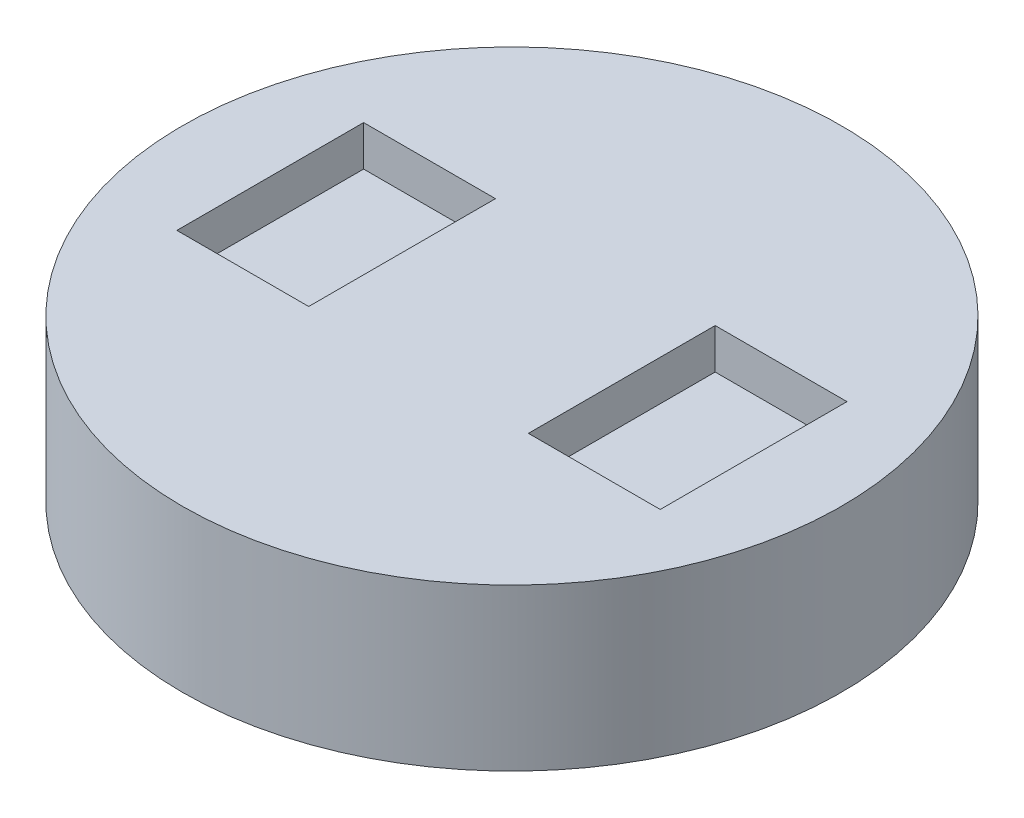
ISO-10303-21;
HEADER;
FILE_DESCRIPTION(('STEP AP214'),'2;1');
FILE_NAME('part.step','',(''),(''),'','','');
FILE_SCHEMA(('AUTOMOTIVE_DESIGN { 1 0 10303 214 1 1 1 1 }'));
ENDSEC;
DATA;
#1=APPLICATION_CONTEXT('core data for automotive mechanical design processes');
#2=APPLICATION_PROTOCOL_DEFINITION('international standard','automotive_design',2000,#1);
#3=PRODUCT_CONTEXT('',#1,'mechanical');
#4=PRODUCT('Part','Part','',(#3));
#5=PRODUCT_RELATED_PRODUCT_CATEGORY('part','',(#4));
#6=PRODUCT_DEFINITION_FORMATION('','',#4);
#7=PRODUCT_DEFINITION_CONTEXT('part definition',#1,'design');
#8=PRODUCT_DEFINITION('design','',#6,#7);
#9=PRODUCT_DEFINITION_SHAPE('','',#8);
#10=(LENGTH_UNIT() NAMED_UNIT(*) SI_UNIT(.MILLI.,.METRE.));
#11=(NAMED_UNIT(*) PLANE_ANGLE_UNIT() SI_UNIT($,.RADIAN.));
#12=(NAMED_UNIT(*) SI_UNIT($,.STERADIAN.) SOLID_ANGLE_UNIT());
#13=UNCERTAINTY_MEASURE_WITH_UNIT(LENGTH_MEASURE(1.E-05),#10,'distance_accuracy_value','');
#14=(GEOMETRIC_REPRESENTATION_CONTEXT(3) GLOBAL_UNCERTAINTY_ASSIGNED_CONTEXT((#13)) GLOBAL_UNIT_ASSIGNED_CONTEXT((#10,
#11,#12)) REPRESENTATION_CONTEXT('',''));
#15=CARTESIAN_POINT('',(0.,0.,0.));
#16=DIRECTION('',(0.,0.,1.));
#17=DIRECTION('',(1.,0.,0.));
#18=AXIS2_PLACEMENT_3D('',#15,#16,#17);
#19=CARTESIAN_POINT('',(0.,8.8,0.));
#20=DIRECTION('',(0.,-1.,0.));
#21=DIRECTION('',(0.,0.,-1.));
#22=AXIS2_PLACEMENT_3D('',#19,#20,#21);
#23=CYLINDRICAL_SURFACE('',#22,18.);
#24=CARTESIAN_POINT('',(0.,8.8,0.));
#25=DIRECTION('',(0.,1.,0.));
#26=DIRECTION('',(0.,0.,1.));
#27=AXIS2_PLACEMENT_3D('',#24,#25,#26);
#28=CIRCLE('',#27,18.);
#29=CARTESIAN_POINT('',(0.,8.8,18.));
#30=VERTEX_POINT('',#29);
#31=EDGE_CURVE('E11',#30,#30,#28,.T.);
#32=ORIENTED_EDGE('',*,*,#31,.F.);
#33=EDGE_LOOP('',(#32));
#34=FACE_BOUND('',#33,.T.);
#35=CARTESIAN_POINT('',(0.,0.,0.));
#36=DIRECTION('',(0.,1.,0.));
#37=DIRECTION('',(0.,0.,1.));
#38=AXIS2_PLACEMENT_3D('',#35,#36,#37);
#39=CIRCLE('',#38,18.);
#40=CARTESIAN_POINT('',(0.,0.,18.));
#41=VERTEX_POINT('',#40);
#42=EDGE_CURVE('E37',#41,#41,#39,.T.);
#43=ORIENTED_EDGE('',*,*,#42,.T.);
#44=EDGE_LOOP('',(#43));
#45=FACE_BOUND('',#44,.T.);
#46=ADVANCED_FACE('F34',(#34,#45),#23,.T.);
#47=CARTESIAN_POINT('',(0.,8.8,0.));
#48=DIRECTION('',(0.,1.,0.));
#49=DIRECTION('',(0.,0.,1.));
#50=AXIS2_PLACEMENT_3D('',#47,#48,#49);
#51=PLANE('',#50);
#52=DIRECTION('',(0.,0.,1.));
#53=VECTOR('',#52,1.);
#54=CARTESIAN_POINT('',(-13.2,8.8,-5.1));
#55=LINE('',#54,#53);
#56=CARTESIAN_POINT('',(-13.2,8.8,-5.1));
#57=VERTEX_POINT('',#56);
#58=CARTESIAN_POINT('',(-13.2,8.8,5.1));
#59=VERTEX_POINT('',#58);
#60=EDGE_CURVE('E48',#57,#59,#55,.T.);
#61=ORIENTED_EDGE('',*,*,#60,.F.);
#62=DIRECTION('',(-1.,0.,0.));
#63=VECTOR('',#62,1.);
#64=CARTESIAN_POINT('',(-13.2,8.8,-5.1));
#65=LINE('',#64,#63);
#66=CARTESIAN_POINT('',(-6.,8.8,-5.1));
#67=VERTEX_POINT('',#66);
#68=EDGE_CURVE('E118',#67,#57,#65,.T.);
#69=ORIENTED_EDGE('',*,*,#68,.F.);
#70=DIRECTION('',(0.,0.,-1.));
#71=VECTOR('',#70,1.);
#72=CARTESIAN_POINT('',(-6.,8.8,-5.1));
#73=LINE('',#72,#71);
#74=CARTESIAN_POINT('',(-6.,8.8,5.1));
#75=VERTEX_POINT('',#74);
#76=EDGE_CURVE('E121',#75,#67,#73,.T.);
#77=ORIENTED_EDGE('',*,*,#76,.F.);
#78=DIRECTION('',(1.,0.,0.));
#79=VECTOR('',#78,1.);
#80=CARTESIAN_POINT('',(-13.2,8.8,5.1));
#81=LINE('',#80,#79);
#82=EDGE_CURVE('E127',#59,#75,#81,.T.);
#83=ORIENTED_EDGE('',*,*,#82,.F.);
#84=EDGE_LOOP('',(#61,#69,#77,#83));
#85=FACE_BOUND('',#84,.T.);
#86=DIRECTION('',(0.,0.,-1.));
#87=VECTOR('',#86,1.);
#88=CARTESIAN_POINT('',(13.2,8.8,-5.1));
#89=LINE('',#88,#87);
#90=CARTESIAN_POINT('',(13.2,8.8,5.1));
#91=VERTEX_POINT('',#90);
#92=CARTESIAN_POINT('',(13.2,8.8,-5.1));
#93=VERTEX_POINT('',#92);
#94=EDGE_CURVE('E56',#91,#93,#89,.T.);
#95=ORIENTED_EDGE('',*,*,#94,.F.);
#96=DIRECTION('',(1.,0.,0.));
#97=VECTOR('',#96,1.);
#98=CARTESIAN_POINT('',(13.2,8.8,5.1));
#99=LINE('',#98,#97);
#100=CARTESIAN_POINT('',(6.,8.8,5.1));
#101=VERTEX_POINT('',#100);
#102=EDGE_CURVE('E141',#101,#91,#99,.T.);
#103=ORIENTED_EDGE('',*,*,#102,.F.);
#104=DIRECTION('',(0.,0.,1.));
#105=VECTOR('',#104,1.);
#106=CARTESIAN_POINT('',(6.,8.8,-5.1));
#107=LINE('',#106,#105);
#108=CARTESIAN_POINT('',(6.,8.8,-5.1));
#109=VERTEX_POINT('',#108);
#110=EDGE_CURVE('E155',#109,#101,#107,.T.);
#111=ORIENTED_EDGE('',*,*,#110,.F.);
#112=DIRECTION('',(-1.,0.,0.));
#113=VECTOR('',#112,1.);
#114=CARTESIAN_POINT('',(13.2,8.8,-5.1));
#115=LINE('',#114,#113);
#116=EDGE_CURVE('E152',#93,#109,#115,.T.);
#117=ORIENTED_EDGE('',*,*,#116,.F.);
#118=EDGE_LOOP('',(#95,#103,#111,#117));
#119=FACE_BOUND('',#118,.T.);
#120=ORIENTED_EDGE('',*,*,#31,.T.);
#121=EDGE_LOOP('',(#120));
#122=FACE_BOUND('',#121,.T.);
#123=ADVANCED_FACE('F172',(#85,#119,#122),#51,.T.);
#124=CARTESIAN_POINT('',(0.,0.,0.));
#125=DIRECTION('',(0.,1.,0.));
#126=DIRECTION('',(0.,0.,1.));
#127=AXIS2_PLACEMENT_3D('',#124,#125,#126);
#128=PLANE('',#127);
#129=ORIENTED_EDGE('',*,*,#42,.F.);
#130=EDGE_LOOP('',(#129));
#131=FACE_BOUND('',#130,.T.);
#132=ADVANCED_FACE('F191',(#131),#128,.F.);
#133=CARTESIAN_POINT('',(13.2,6.6,-5.1));
#134=DIRECTION('',(1.,0.,0.));
#135=DIRECTION('',(0.,0.,-1.));
#136=AXIS2_PLACEMENT_3D('',#133,#134,#135);
#137=PLANE('',#136);
#138=ORIENTED_EDGE('',*,*,#94,.T.);
#139=DIRECTION('',(0.,1.,0.));
#140=VECTOR('',#139,1.);
#141=CARTESIAN_POINT('',(13.2,6.6,-5.1));
#142=LINE('',#141,#140);
#143=CARTESIAN_POINT('',(13.2,6.6,-5.1));
#144=VERTEX_POINT('',#143);
#145=EDGE_CURVE('E150',#144,#93,#142,.T.);
#146=ORIENTED_EDGE('',*,*,#145,.F.);
#147=DIRECTION('',(0.,0.,-1.));
#148=VECTOR('',#147,1.);
#149=CARTESIAN_POINT('',(13.2,6.6,-5.1));
#150=LINE('',#149,#148);
#151=CARTESIAN_POINT('',(13.2,6.6,5.1));
#152=VERTEX_POINT('',#151);
#153=EDGE_CURVE('E137',#152,#144,#150,.T.);
#154=ORIENTED_EDGE('',*,*,#153,.F.);
#155=DIRECTION('',(0.,1.,0.));
#156=VECTOR('',#155,1.);
#157=CARTESIAN_POINT('',(13.2,6.6,5.1));
#158=LINE('',#157,#156);
#159=EDGE_CURVE('E128',#152,#91,#158,.T.);
#160=ORIENTED_EDGE('',*,*,#159,.T.);
#161=EDGE_LOOP('',(#138,#146,#154,#160));
#162=FACE_BOUND('',#161,.T.);
#163=ADVANCED_FACE('F181',(#162),#137,.F.);
#164=CARTESIAN_POINT('',(13.2,6.6,5.1));
#165=DIRECTION('',(0.,0.,1.));
#166=DIRECTION('',(1.,0.,0.));
#167=AXIS2_PLACEMENT_3D('',#164,#165,#166);
#168=PLANE('',#167);
#169=ORIENTED_EDGE('',*,*,#102,.T.);
#170=ORIENTED_EDGE('',*,*,#159,.F.);
#171=DIRECTION('',(1.,0.,0.));
#172=VECTOR('',#171,1.);
#173=CARTESIAN_POINT('',(13.2,6.6,5.1));
#174=LINE('',#173,#172);
#175=CARTESIAN_POINT('',(6.,6.6,5.1));
#176=VERTEX_POINT('',#175);
#177=EDGE_CURVE('E147',#176,#152,#174,.T.);
#178=ORIENTED_EDGE('',*,*,#177,.F.);
#179=DIRECTION('',(0.,1.,0.));
#180=VECTOR('',#179,1.);
#181=CARTESIAN_POINT('',(6.,6.6,5.1));
#182=LINE('',#181,#180);
#183=EDGE_CURVE('E161',#176,#101,#182,.T.);
#184=ORIENTED_EDGE('',*,*,#183,.T.);
#185=EDGE_LOOP('',(#169,#170,#178,#184));
#186=FACE_BOUND('',#185,.T.);
#187=ADVANCED_FACE('F183',(#186),#168,.F.);
#188=CARTESIAN_POINT('',(6.,6.6,-5.1));
#189=DIRECTION('',(-1.,0.,0.));
#190=DIRECTION('',(0.,0.,1.));
#191=AXIS2_PLACEMENT_3D('',#188,#189,#190);
#192=PLANE('',#191);
#193=ORIENTED_EDGE('',*,*,#110,.T.);
#194=ORIENTED_EDGE('',*,*,#183,.F.);
#195=DIRECTION('',(0.,0.,1.));
#196=VECTOR('',#195,1.);
#197=CARTESIAN_POINT('',(6.,6.6,-5.1));
#198=LINE('',#197,#196);
#199=CARTESIAN_POINT('',(6.,6.6,-5.1));
#200=VERTEX_POINT('',#199);
#201=EDGE_CURVE('E144',#200,#176,#198,.T.);
#202=ORIENTED_EDGE('',*,*,#201,.F.);
#203=DIRECTION('',(0.,1.,0.));
#204=VECTOR('',#203,1.);
#205=CARTESIAN_POINT('',(6.,6.6,-5.1));
#206=LINE('',#205,#204);
#207=EDGE_CURVE('E163',#200,#109,#206,.T.);
#208=ORIENTED_EDGE('',*,*,#207,.T.);
#209=EDGE_LOOP('',(#193,#194,#202,#208));
#210=FACE_BOUND('',#209,.T.);
#211=ADVANCED_FACE('F176',(#210),#192,.F.);
#212=CARTESIAN_POINT('',(13.2,6.6,-5.1));
#213=DIRECTION('',(0.,0.,-1.));
#214=DIRECTION('',(-1.,0.,0.));
#215=AXIS2_PLACEMENT_3D('',#212,#213,#214);
#216=PLANE('',#215);
#217=ORIENTED_EDGE('',*,*,#116,.T.);
#218=ORIENTED_EDGE('',*,*,#207,.F.);
#219=DIRECTION('',(-1.,0.,0.));
#220=VECTOR('',#219,1.);
#221=CARTESIAN_POINT('',(13.2,6.6,-5.1));
#222=LINE('',#221,#220);
#223=EDGE_CURVE('E140',#144,#200,#222,.T.);
#224=ORIENTED_EDGE('',*,*,#223,.F.);
#225=ORIENTED_EDGE('',*,*,#145,.T.);
#226=EDGE_LOOP('',(#217,#218,#224,#225));
#227=FACE_BOUND('',#226,.T.);
#228=ADVANCED_FACE('F168',(#227),#216,.F.);
#229=CARTESIAN_POINT('',(0.,6.6,0.));
#230=DIRECTION('',(0.,-1.,0.));
#231=DIRECTION('',(0.,0.,-1.));
#232=AXIS2_PLACEMENT_3D('',#229,#230,#231);
#233=PLANE('',#232);
#234=ORIENTED_EDGE('',*,*,#153,.T.);
#235=ORIENTED_EDGE('',*,*,#223,.T.);
#236=ORIENTED_EDGE('',*,*,#201,.T.);
#237=ORIENTED_EDGE('',*,*,#177,.T.);
#238=EDGE_LOOP('',(#234,#235,#236,#237));
#239=FACE_BOUND('',#238,.T.);
#240=ADVANCED_FACE('F180',(#239),#233,.F.);
#241=CARTESIAN_POINT('',(-13.2,6.6,-5.1));
#242=DIRECTION('',(-1.,0.,0.));
#243=DIRECTION('',(0.,0.,1.));
#244=AXIS2_PLACEMENT_3D('',#241,#242,#243);
#245=PLANE('',#244);
#246=ORIENTED_EDGE('',*,*,#60,.T.);
#247=DIRECTION('',(0.,1.,0.));
#248=VECTOR('',#247,1.);
#249=CARTESIAN_POINT('',(-13.2,6.6,5.1));
#250=LINE('',#249,#248);
#251=CARTESIAN_POINT('',(-13.2,6.6,5.1));
#252=VERTEX_POINT('',#251);
#253=EDGE_CURVE('E96',#252,#59,#250,.T.);
#254=ORIENTED_EDGE('',*,*,#253,.F.);
#255=DIRECTION('',(0.,0.,1.));
#256=VECTOR('',#255,1.);
#257=CARTESIAN_POINT('',(-13.2,6.6,-5.1));
#258=LINE('',#257,#256);
#259=CARTESIAN_POINT('',(-13.2,6.6,-5.1));
#260=VERTEX_POINT('',#259);
#261=EDGE_CURVE('E100',#260,#252,#258,.T.);
#262=ORIENTED_EDGE('',*,*,#261,.F.);
#263=DIRECTION('',(0.,1.,0.));
#264=VECTOR('',#263,1.);
#265=CARTESIAN_POINT('',(-13.2,6.6,-5.1));
#266=LINE('',#265,#264);
#267=EDGE_CURVE('E132',#260,#57,#266,.T.);
#268=ORIENTED_EDGE('',*,*,#267,.T.);
#269=EDGE_LOOP('',(#246,#254,#262,#268));
#270=FACE_BOUND('',#269,.T.);
#271=ADVANCED_FACE('F98',(#270),#245,.F.);
#272=CARTESIAN_POINT('',(-13.2,6.6,-5.1));
#273=DIRECTION('',(0.,0.,-1.));
#274=DIRECTION('',(-1.,0.,0.));
#275=AXIS2_PLACEMENT_3D('',#272,#273,#274);
#276=PLANE('',#275);
#277=ORIENTED_EDGE('',*,*,#68,.T.);
#278=ORIENTED_EDGE('',*,*,#267,.F.);
#279=DIRECTION('',(-1.,0.,0.));
#280=VECTOR('',#279,1.);
#281=CARTESIAN_POINT('',(-13.2,6.6,-5.1));
#282=LINE('',#281,#280);
#283=CARTESIAN_POINT('',(-6.,6.6,-5.1));
#284=VERTEX_POINT('',#283);
#285=EDGE_CURVE('E106',#284,#260,#282,.T.);
#286=ORIENTED_EDGE('',*,*,#285,.F.);
#287=DIRECTION('',(0.,1.,0.));
#288=VECTOR('',#287,1.);
#289=CARTESIAN_POINT('',(-6.,6.6,-5.1));
#290=LINE('',#289,#288);
#291=EDGE_CURVE('E134',#284,#67,#290,.T.);
#292=ORIENTED_EDGE('',*,*,#291,.T.);
#293=EDGE_LOOP('',(#277,#278,#286,#292));
#294=FACE_BOUND('',#293,.T.);
#295=ADVANCED_FACE('F217',(#294),#276,.F.);
#296=CARTESIAN_POINT('',(-6.,6.6,-5.1));
#297=DIRECTION('',(1.,0.,0.));
#298=DIRECTION('',(0.,0.,-1.));
#299=AXIS2_PLACEMENT_3D('',#296,#297,#298);
#300=PLANE('',#299);
#301=ORIENTED_EDGE('',*,*,#76,.T.);
#302=ORIENTED_EDGE('',*,*,#291,.F.);
#303=DIRECTION('',(0.,0.,-1.));
#304=VECTOR('',#303,1.);
#305=CARTESIAN_POINT('',(-6.,6.6,-5.1));
#306=LINE('',#305,#304);
#307=CARTESIAN_POINT('',(-6.,6.6,5.1));
#308=VERTEX_POINT('',#307);
#309=EDGE_CURVE('E114',#308,#284,#306,.T.);
#310=ORIENTED_EDGE('',*,*,#309,.F.);
#311=DIRECTION('',(0.,1.,0.));
#312=VECTOR('',#311,1.);
#313=CARTESIAN_POINT('',(-6.,6.6,5.1));
#314=LINE('',#313,#312);
#315=EDGE_CURVE('E105',#308,#75,#314,.T.);
#316=ORIENTED_EDGE('',*,*,#315,.T.);
#317=EDGE_LOOP('',(#301,#302,#310,#316));
#318=FACE_BOUND('',#317,.T.);
#319=ADVANCED_FACE('F222',(#318),#300,.F.);
#320=CARTESIAN_POINT('',(-13.2,6.6,5.1));
#321=DIRECTION('',(0.,0.,1.));
#322=DIRECTION('',(1.,0.,0.));
#323=AXIS2_PLACEMENT_3D('',#320,#321,#322);
#324=PLANE('',#323);
#325=ORIENTED_EDGE('',*,*,#82,.T.);
#326=ORIENTED_EDGE('',*,*,#315,.F.);
#327=DIRECTION('',(1.,0.,0.));
#328=VECTOR('',#327,1.);
#329=CARTESIAN_POINT('',(-13.2,6.6,5.1));
#330=LINE('',#329,#328);
#331=EDGE_CURVE('E109',#252,#308,#330,.T.);
#332=ORIENTED_EDGE('',*,*,#331,.F.);
#333=ORIENTED_EDGE('',*,*,#253,.T.);
#334=EDGE_LOOP('',(#325,#326,#332,#333));
#335=FACE_BOUND('',#334,.T.);
#336=ADVANCED_FACE('F110',(#335),#324,.F.);
#337=CARTESIAN_POINT('',(0.,6.6,0.));
#338=DIRECTION('',(0.,1.,0.));
#339=DIRECTION('',(0.,0.,1.));
#340=AXIS2_PLACEMENT_3D('',#337,#338,#339);
#341=PLANE('',#340);
#342=ORIENTED_EDGE('',*,*,#261,.T.);
#343=ORIENTED_EDGE('',*,*,#331,.T.);
#344=ORIENTED_EDGE('',*,*,#309,.T.);
#345=ORIENTED_EDGE('',*,*,#285,.T.);
#346=EDGE_LOOP('',(#342,#343,#344,#345));
#347=FACE_BOUND('',#346,.T.);
#348=ADVANCED_FACE('F116',(#347),#341,.T.);
#349=CLOSED_SHELL('',(#46,#123,#132,#163,#187,#211,#228,#240,#271,#295,#319,#336,#348));
#350=MANIFOLD_SOLID_BREP('B2',#349);
#351=ADVANCED_BREP_SHAPE_REPRESENTATION('',(#18,#350),#14);
#352=SHAPE_DEFINITION_REPRESENTATION(#9,#351);
ENDSEC;
END-ISO-10303-21;
